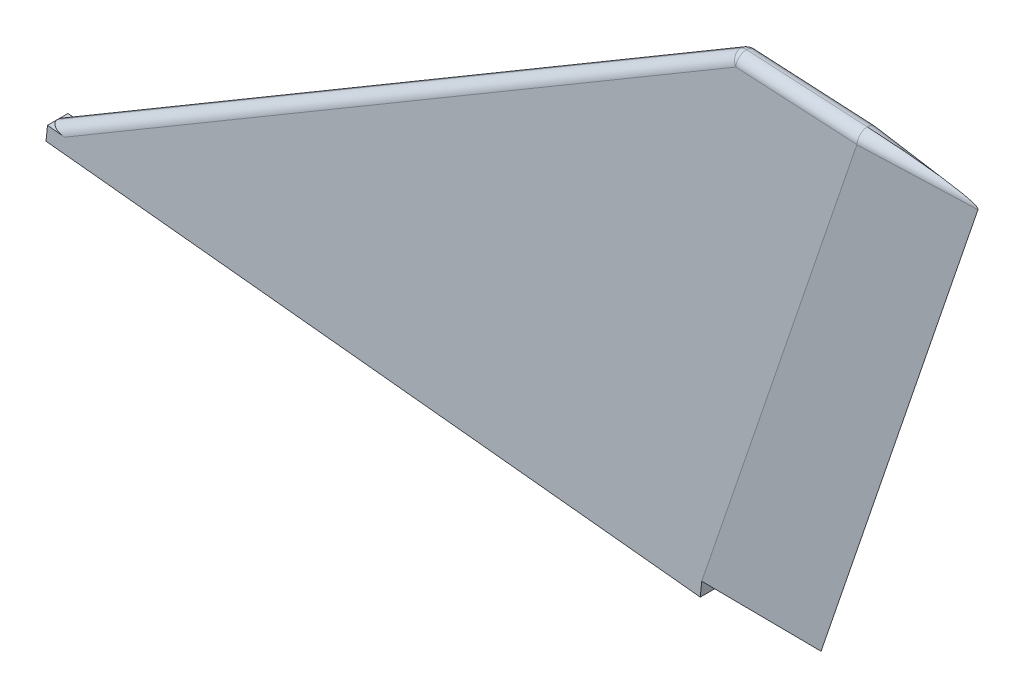
ISO-10303-21;
HEADER;
FILE_DESCRIPTION(('STEP AP214'),'2;1');
FILE_NAME('part.step','',(''),(''),'','','');
FILE_SCHEMA(('AUTOMOTIVE_DESIGN { 1 0 10303 214 1 1 1 1 }'));
ENDSEC;
DATA;
#1=APPLICATION_CONTEXT('core data for automotive mechanical design processes');
#2=APPLICATION_PROTOCOL_DEFINITION('international standard','automotive_design',2000,#1);
#3=PRODUCT_CONTEXT('',#1,'mechanical');
#4=PRODUCT('Part','Part','',(#3));
#5=PRODUCT_RELATED_PRODUCT_CATEGORY('part','',(#4));
#6=PRODUCT_DEFINITION_FORMATION('','',#4);
#7=PRODUCT_DEFINITION_CONTEXT('part definition',#1,'design');
#8=PRODUCT_DEFINITION('design','',#6,#7);
#9=PRODUCT_DEFINITION_SHAPE('','',#8);
#10=(LENGTH_UNIT() NAMED_UNIT(*) SI_UNIT(.MILLI.,.METRE.));
#11=(NAMED_UNIT(*) PLANE_ANGLE_UNIT() SI_UNIT($,.RADIAN.));
#12=(NAMED_UNIT(*) SI_UNIT($,.STERADIAN.) SOLID_ANGLE_UNIT());
#13=UNCERTAINTY_MEASURE_WITH_UNIT(LENGTH_MEASURE(1.E-05),#10,'distance_accuracy_value','');
#14=(GEOMETRIC_REPRESENTATION_CONTEXT(3) GLOBAL_UNCERTAINTY_ASSIGNED_CONTEXT((#13)) GLOBAL_UNIT_ASSIGNED_CONTEXT((#10,
#11,#12)) REPRESENTATION_CONTEXT('',''));
#15=CARTESIAN_POINT('',(0.,0.,0.));
#16=DIRECTION('',(0.,0.,1.));
#17=DIRECTION('',(1.,0.,0.));
#18=AXIS2_PLACEMENT_3D('',#15,#16,#17);
#19=CARTESIAN_POINT('',(0.,0.,3.5));
#20=DIRECTION('',(0.102966143613121,0.994684861284941,0.));
#21=DIRECTION('',(-0.994684861284941,0.102966143613121,0.));
#22=AXIS2_PLACEMENT_3D('',#19,#20,#21);
#23=PLANE('',#22);
#24=DIRECTION('',(0.,0.,1.));
#25=VECTOR('',#24,1.);
#26=CARTESIAN_POINT('',(223.462347280627,-23.1320059626714,3.5));
#27=LINE('',#26,#25);
#28=CARTESIAN_POINT('',(223.462347280627,-23.1320059626714,-3.5));
#29=VERTEX_POINT('',#28);
#30=CARTESIAN_POINT('',(223.462347280627,-23.1320059626714,3.5));
#31=VERTEX_POINT('',#30);
#32=EDGE_CURVE('E210',#29,#31,#27,.T.);
#33=ORIENTED_EDGE('',*,*,#32,.F.);
#34=DIRECTION('',(0.990367658718156,-0.102519242572601,0.0930682838965964));
#35=VECTOR('',#34,1.);
#36=CARTESIAN_POINT('',(2.5807677641766,-0.267151652328405,-24.2570081363247));
#37=LINE('',#36,#35);
#38=CARTESIAN_POINT('',(260.706902142783,-26.9874262409992,0.));
#39=VERTEX_POINT('',#38);
#40=EDGE_CURVE('E183',#29,#39,#37,.T.);
#41=ORIENTED_EDGE('',*,*,#40,.T.);
#42=DIRECTION('',(-0.990367658718156,0.102519242572601,0.0930682838965968));
#43=VECTOR('',#42,1.);
#44=CARTESIAN_POINT('',(1.9355650352115,-0.200362622520131,24.317640074597));
#45=LINE('',#44,#43);
#46=EDGE_CURVE('E191',#39,#31,#45,.T.);
#47=ORIENTED_EDGE('',*,*,#46,.T.);
#48=EDGE_LOOP('',(#33,#41,#47));
#49=FACE_BOUND('',#48,.T.);
#50=ADVANCED_FACE('F32',(#49),#23,.F.);
#51=CARTESIAN_POINT('',(0.,0.,3.5));
#52=DIRECTION('',(0.,0.,-1.));
#53=DIRECTION('',(-1.,0.,0.));
#54=AXIS2_PLACEMENT_3D('',#51,#52,#53);
#55=PLANE('',#54);
#56=DIRECTION('',(0.322265695230508,0.946649260115697,0.));
#57=VECTOR('',#56,1.);
#58=CARTESIAN_POINT('',(207.311566140184,-70.5746138578575,3.5));
#59=LINE('',#58,#57);
#60=CARTESIAN_POINT('',(276.424242310279,132.44253853945,3.5));
#61=VERTEX_POINT('',#60);
#62=EDGE_CURVE('E194',#31,#61,#59,.T.);
#63=ORIENTED_EDGE('',*,*,#62,.T.);
#64=CARTESIAN_POINT('',(238.415187689493,134.571777891605,3.5));
#65=DIRECTION('',(0.,0.,-1.));
#66=DIRECTION('',(0.998564849047937,-0.0535559730176782,0.));
#67=AXIS2_PLACEMENT_3D('',#64,#65,#66);
#68=ELLIPSE('',#67,38.0812921018752,3.5);
#69=CARTESIAN_POINT('',(276.441827388753,132.532297239319,3.5));
#70=VERTEX_POINT('',#69);
#71=EDGE_CURVE('E124',#61,#70,#68,.F.);
#72=ORIENTED_EDGE('',*,*,#71,.T.);
#73=DIRECTION('',(-0.998564849047937,0.0535559730176782,0.));
#74=VECTOR('',#73,1.);
#75=CARTESIAN_POINT('',(7.88061171036618,146.936025984807,3.5));
#76=LINE('',#75,#74);
#77=CARTESIAN_POINT('',(235.077713941852,134.750776435512,3.5));
#78=VERTEX_POINT('',#77);
#79=EDGE_CURVE('E168',#70,#78,#76,.T.);
#80=ORIENTED_EDGE('',*,*,#79,.T.);
#81=DIRECTION('',(-0.861077465248671,-0.5084737936619,0.));
#82=VECTOR('',#81,1.);
#83=CARTESIAN_POINT('',(1.77965827781667,-3.01377112837037,3.5));
#84=LINE('',#83,#82);
#85=CARTESIAN_POINT('',(5.85666837283251,-0.606260917646307,3.5));
#86=VERTEX_POINT('',#85);
#87=EDGE_CURVE('E197',#78,#86,#84,.T.);
#88=ORIENTED_EDGE('',*,*,#87,.T.);
#89=DIRECTION('',(-0.994684861284941,0.102966143613121,0.));
#90=VECTOR('',#89,1.);
#91=CARTESIAN_POINT('',(0.,0.,3.5));
#92=LINE('',#91,#90);
#93=CARTESIAN_POINT('',(0.,0.,3.5));
#94=VERTEX_POINT('',#93);
#95=EDGE_CURVE('E242',#86,#94,#92,.T.);
#96=ORIENTED_EDGE('',*,*,#95,.T.);
#97=DIRECTION('',(0.102966143613121,0.994684861284941,0.));
#98=VECTOR('',#97,1.);
#99=CARTESIAN_POINT('',(-0.514830718065607,-4.9734243064247,3.5));
#100=LINE('',#99,#98);
#101=CARTESIAN_POINT('',(-0.514830718065607,-4.9734243064247,3.5));
#102=VERTEX_POINT('',#101);
#103=EDGE_CURVE('E148',#102,#94,#100,.T.);
#104=ORIENTED_EDGE('',*,*,#103,.F.);
#105=DIRECTION('',(-0.994684861284941,0.102966143613121,0.));
#106=VECTOR('',#105,1.);
#107=CARTESIAN_POINT('',(-0.514830718065607,-4.9734243064247,3.5));
#108=LINE('',#107,#106);
#109=CARTESIAN_POINT('',(222.947516562561,-28.1054302690961,3.5));
#110=VERTEX_POINT('',#109);
#111=EDGE_CURVE('E215',#110,#102,#108,.T.);
#112=ORIENTED_EDGE('',*,*,#111,.F.);
#113=DIRECTION('',(0.102966143613121,0.994684861284941,0.));
#114=VECTOR('',#113,1.);
#115=CARTESIAN_POINT('',(222.947516562561,-28.1054302690961,3.5));
#116=LINE('',#115,#114);
#117=EDGE_CURVE('E204',#110,#31,#116,.T.);
#118=ORIENTED_EDGE('',*,*,#117,.T.);
#119=EDGE_LOOP('',(#63,#72,#80,#88,#96,#104,#112,#118));
#120=FACE_BOUND('',#119,.T.);
#121=ADVANCED_FACE('F200',(#120),#55,.F.);
#122=CARTESIAN_POINT('',(0.,0.,-3.5));
#123=DIRECTION('',(0.,0.,-1.));
#124=DIRECTION('',(-1.,0.,0.));
#125=AXIS2_PLACEMENT_3D('',#122,#123,#124);
#126=PLANE('',#125);
#127=DIRECTION('',(-0.998564849047937,0.0535559730176782,0.));
#128=VECTOR('',#127,1.);
#129=CARTESIAN_POINT('',(277.438934642848,132.47881944141,-3.5));
#130=LINE('',#129,#128);
#131=CARTESIAN_POINT('',(235.077713941852,134.750776435511,-3.5));
#132=VERTEX_POINT('',#131);
#133=CARTESIAN_POINT('',(276.441827388753,132.532297239319,-3.5));
#134=VERTEX_POINT('',#133);
#135=EDGE_CURVE('E117',#132,#134,#130,.F.);
#136=ORIENTED_EDGE('',*,*,#135,.T.);
#137=CARTESIAN_POINT('',(238.415187689493,134.571777891605,-3.5));
#138=DIRECTION('',(0.,0.,-1.));
#139=DIRECTION('',(-0.998564849047937,0.0535559730176782,0.));
#140=AXIS2_PLACEMENT_3D('',#137,#138,#139);
#141=ELLIPSE('',#140,38.0812921018753,3.5);
#142=CARTESIAN_POINT('',(276.424242310279,132.44253853945,-3.5));
#143=VERTEX_POINT('',#142);
#144=EDGE_CURVE('E136',#134,#143,#141,.T.);
#145=ORIENTED_EDGE('',*,*,#144,.T.);
#146=DIRECTION('',(0.322265695230508,0.946649260115697,0.));
#147=VECTOR('',#146,1.);
#148=CARTESIAN_POINT('',(199.07844233664,-94.759256134135,-3.5));
#149=LINE('',#148,#147);
#150=EDGE_CURVE('E126',#29,#143,#149,.T.);
#151=ORIENTED_EDGE('',*,*,#150,.F.);
#152=DIRECTION('',(0.102966143613121,0.994684861284941,0.));
#153=VECTOR('',#152,1.);
#154=CARTESIAN_POINT('',(222.947516562561,-28.1054302690961,-3.5));
#155=LINE('',#154,#153);
#156=CARTESIAN_POINT('',(222.947516562561,-28.1054302690961,-3.5));
#157=VERTEX_POINT('',#156);
#158=EDGE_CURVE('E214',#157,#29,#155,.T.);
#159=ORIENTED_EDGE('',*,*,#158,.F.);
#160=DIRECTION('',(0.994684861284941,-0.102966143613121,0.));
#161=VECTOR('',#160,1.);
#162=CARTESIAN_POINT('',(-0.514830718065607,-4.9734243064247,-3.5));
#163=LINE('',#162,#161);
#164=CARTESIAN_POINT('',(-0.514830718065607,-4.9734243064247,-3.5));
#165=VERTEX_POINT('',#164);
#166=EDGE_CURVE('E249',#165,#157,#163,.T.);
#167=ORIENTED_EDGE('',*,*,#166,.F.);
#168=DIRECTION('',(0.102966143613121,0.994684861284941,0.));
#169=VECTOR('',#168,1.);
#170=CARTESIAN_POINT('',(-0.514830718065607,-4.9734243064247,-3.5));
#171=LINE('',#170,#169);
#172=CARTESIAN_POINT('',(0.,0.,-3.5));
#173=VERTEX_POINT('',#172);
#174=EDGE_CURVE('E226',#165,#173,#171,.T.);
#175=ORIENTED_EDGE('',*,*,#174,.T.);
#176=DIRECTION('',(0.994684861284941,-0.102966143613121,0.));
#177=VECTOR('',#176,1.);
#178=CARTESIAN_POINT('',(223.462347280627,-23.1320059626714,-3.5));
#179=LINE('',#178,#177);
#180=CARTESIAN_POINT('',(5.85666837283247,-0.606260917646303,-3.5));
#181=VERTEX_POINT('',#180);
#182=EDGE_CURVE('E121',#173,#181,#179,.T.);
#183=ORIENTED_EDGE('',*,*,#182,.T.);
#184=DIRECTION('',(-0.861077465248671,-0.5084737936619,0.));
#185=VECTOR('',#184,1.);
#186=CARTESIAN_POINT('',(235.988549897284,135.288633053938,-3.5));
#187=LINE('',#186,#185);
#188=EDGE_CURVE('E113',#181,#132,#187,.F.);
#189=ORIENTED_EDGE('',*,*,#188,.T.);
#190=EDGE_LOOP('',(#136,#145,#151,#159,#167,#175,#183,#189));
#191=FACE_BOUND('',#190,.T.);
#192=ADVANCED_FACE('F115',(#191),#126,.T.);
#193=CARTESIAN_POINT('',(233.631140330863,-106.521954010048,0.));
#194=DIRECTION('',(-0.0903601079041338,0.0307610899006781,-0.995433978849263));
#195=DIRECTION('',(-0.995905275386413,0.,0.0904028896524531));
#196=AXIS2_PLACEMENT_3D('',#193,#194,#195);
#197=PLANE('',#196);
#198=DIRECTION('',(0.322265695230508,0.946649260115697,0.));
#199=VECTOR('',#198,1.);
#200=CARTESIAN_POINT('',(233.631140330863,-106.521954010048,0.));
#201=LINE('',#200,#199);
#202=CARTESIAN_POINT('',(314.289932093839,130.411690105041,0.));
#203=VERTEX_POINT('',#202);
#204=EDGE_CURVE('E185',#39,#203,#201,.T.);
#205=ORIENTED_EDGE('',*,*,#204,.T.);
#206=DIRECTION('',(0.994338366520276,-0.0533292943153116,-0.0919086461309347));
#207=VECTOR('',#206,1.);
#208=CARTESIAN_POINT('',(247.105842365662,134.01497065325,6.20995723021824));
#209=LINE('',#208,#207);
#210=EDGE_CURVE('E142',#203,#61,#209,.F.);
#211=ORIENTED_EDGE('',*,*,#210,.T.);
#212=ORIENTED_EDGE('',*,*,#62,.F.);
#213=ORIENTED_EDGE('',*,*,#46,.F.);
#214=EDGE_LOOP('',(#205,#211,#212,#213));
#215=FACE_BOUND('',#214,.T.);
#216=ADVANCED_FACE('F207',(#215),#197,.F.);
#217=CARTESIAN_POINT('',(233.631140330863,-106.521954010049,0.));
#218=DIRECTION('',(-0.0903601079041334,0.030761089900678,0.995433978849263));
#219=DIRECTION('',(0.995905275386413,0.,0.0904028896524527));
#220=AXIS2_PLACEMENT_3D('',#217,#218,#219);
#221=PLANE('',#220);
#222=ORIENTED_EDGE('',*,*,#150,.T.);
#223=DIRECTION('',(-0.994338366520276,0.0533292943153116,-0.0919086461309343));
#224=VECTOR('',#223,1.);
#225=CARTESIAN_POINT('',(247.105842365662,134.01497065325,-6.20995723021822));
#226=LINE('',#225,#224);
#227=EDGE_CURVE('E51',#143,#203,#226,.F.);
#228=ORIENTED_EDGE('',*,*,#227,.T.);
#229=ORIENTED_EDGE('',*,*,#204,.F.);
#230=ORIENTED_EDGE('',*,*,#40,.F.);
#231=EDGE_LOOP('',(#222,#228,#229,#230));
#232=FACE_BOUND('',#231,.T.);
#233=ADVANCED_FACE('F181',(#232),#221,.F.);
#234=CARTESIAN_POINT('',(235.988549897284,135.288633053938,0.));
#235=DIRECTION('',(0.861077465248671,0.5084737936619,0.));
#236=DIRECTION('',(-0.5084737936619,0.861077465248671,0.));
#237=AXIS2_PLACEMENT_3D('',#234,#235,#236);
#238=CYLINDRICAL_SURFACE('',#237,3.5);
#239=CARTESIAN_POINT('',(235.077713941852,134.750776435511,0.));
#240=DIRECTION('',(0.861077465248667,0.508473793661906,0.));
#241=DIRECTION('',(-0.508473793661906,0.861077465248667,0.));
#242=AXIS2_PLACEMENT_3D('',#239,#240,#241);
#243=CIRCLE('',#242,3.5);
#244=CARTESIAN_POINT('',(233.298055664036,137.764547563882,0.));
#245=VERTEX_POINT('',#244);
#246=EDGE_CURVE('E36',#132,#245,#243,.T.);
#247=ORIENTED_EDGE('',*,*,#246,.F.);
#248=ORIENTED_EDGE('',*,*,#188,.F.);
#249=CARTESIAN_POINT('',(5.85666837283247,-0.606260917646317,0.));
#250=DIRECTION('',(0.102966143613121,0.994684861284941,0.));
#251=DIRECTION('',(0.994684861284941,-0.102966143613121,0.));
#252=AXIS2_PLACEMENT_3D('',#249,#250,#251);
#253=ELLIPSE('',#252,5.88796371673615,3.5);
#254=CARTESIAN_POINT('',(0.,0.,0.));
#255=VERTEX_POINT('',#254);
#256=EDGE_CURVE('E42',#255,#181,#253,.F.);
#257=ORIENTED_EDGE('',*,*,#256,.F.);
#258=DIRECTION('',(-0.861077465248671,-0.5084737936619,0.));
#259=VECTOR('',#258,1.);
#260=CARTESIAN_POINT('',(0.,0.,0.));
#261=LINE('',#260,#259);
#262=EDGE_CURVE('E76',#245,#255,#261,.T.);
#263=ORIENTED_EDGE('',*,*,#262,.F.);
#264=EDGE_LOOP('',(#247,#248,#257,#263));
#265=FACE_BOUND('',#264,.T.);
#266=ADVANCED_FACE('F34',(#265),#238,.T.);
#267=CARTESIAN_POINT('',(235.077713941852,134.750776435511,0.));
#268=DIRECTION('',(0.,0.,1.));
#269=DIRECTION('',(1.,0.,0.));
#270=AXIS2_PLACEMENT_3D('',#267,#268,#269);
#271=SPHERICAL_SURFACE('',#270,3.5);
#272=CARTESIAN_POINT('',(235.077713941852,134.750776435511,0.));
#273=DIRECTION('',(-0.998564849047937,0.053555973017681,0.));
#274=DIRECTION('',(-0.053555973017681,-0.998564849047937,0.));
#275=AXIS2_PLACEMENT_3D('',#272,#273,#274);
#276=CIRCLE('',#275,3.5);
#277=CARTESIAN_POINT('',(235.265159847414,138.245753407179,0.));
#278=VERTEX_POINT('',#277);
#279=EDGE_CURVE('E127',#132,#278,#276,.F.);
#280=ORIENTED_EDGE('',*,*,#279,.F.);
#281=ORIENTED_EDGE('',*,*,#246,.T.);
#282=CARTESIAN_POINT('',(235.077713941852,134.750776435511,0.));
#283=DIRECTION('',(0.,0.,-1.));
#284=DIRECTION('',(-1.,0.,0.));
#285=AXIS2_PLACEMENT_3D('',#282,#283,#284);
#286=CIRCLE('',#285,3.5);
#287=EDGE_CURVE('E67',#278,#245,#286,.F.);
#288=ORIENTED_EDGE('',*,*,#287,.F.);
#289=EDGE_LOOP('',(#280,#281,#288));
#290=FACE_BOUND('',#289,.T.);
#291=ADVANCED_FACE('F128',(#290),#271,.T.);
#292=CARTESIAN_POINT('',(315.29484208677,130.448495662679,3.60613729549153));
#293=DIRECTION('',(-0.994338366520275,0.0533292943153116,-0.0919086461309342));
#294=DIRECTION('',(-0.0920396202877102,0.,0.995755345603173));
#295=AXIS2_PLACEMENT_3D('',#292,#293,#294);
#296=CYLINDRICAL_SURFACE('',#295,3.5);
#297=ORIENTED_EDGE('',*,*,#227,.F.);
#298=ORIENTED_EDGE('',*,*,#144,.F.);
#299=CARTESIAN_POINT('',(276.280877473053,132.540929457197,0.));
#300=DIRECTION('',(-0.997507668797845,0.053499273328116,-0.0460030264531912));
#301=DIRECTION('',(0.0459370051659809,-0.00246373684345879,-0.998941300356105));
#302=AXIS2_PLACEMENT_3D('',#299,#300,#301);
#303=ELLIPSE('',#302,3.50370937586854,3.5);
#304=CARTESIAN_POINT('',(276.468323378615,136.035906428864,0.));
#305=VERTEX_POINT('',#304);
#306=EDGE_CURVE('E132',#305,#134,#303,.T.);
#307=ORIENTED_EDGE('',*,*,#306,.F.);
#308=CARTESIAN_POINT('',(276.280877473053,132.540929457197,0.));
#309=DIRECTION('',(0.,0.,-1.));
#310=DIRECTION('',(0.998564849047937,-0.0535559730176782,0.));
#311=AXIS2_PLACEMENT_3D('',#308,#309,#310);
#312=ELLIPSE('',#311,38.0812921018752,3.5);
#313=EDGE_CURVE('E156',#203,#305,#312,.F.);
#314=ORIENTED_EDGE('',*,*,#313,.F.);
#315=EDGE_LOOP('',(#297,#298,#307,#314));
#316=FACE_BOUND('',#315,.T.);
#317=ADVANCED_FACE('F176',(#316),#296,.T.);
#318=CARTESIAN_POINT('',(1.77965827781667,-3.01377112837037,0.));
#319=DIRECTION('',(-0.861077465248671,-0.5084737936619,0.));
#320=DIRECTION('',(0.5084737936619,-0.861077465248671,0.));
#321=AXIS2_PLACEMENT_3D('',#318,#319,#320);
#322=CYLINDRICAL_SURFACE('',#321,3.5);
#323=CARTESIAN_POINT('',(5.85666837283252,-0.606260917646307,0.));
#324=DIRECTION('',(0.102966143613121,0.994684861284941,0.));
#325=DIRECTION('',(-0.994684861284941,0.102966143613121,0.));
#326=AXIS2_PLACEMENT_3D('',#323,#324,#325);
#327=ELLIPSE('',#326,5.88796371673615,3.5);
#328=EDGE_CURVE('E11',#86,#255,#327,.F.);
#329=ORIENTED_EDGE('',*,*,#328,.F.);
#330=ORIENTED_EDGE('',*,*,#87,.F.);
#331=CARTESIAN_POINT('',(235.077713941852,134.750776435511,0.));
#332=DIRECTION('',(0.86107746524867,0.5084737936619,0.));
#333=DIRECTION('',(-0.5084737936619,0.86107746524867,0.));
#334=AXIS2_PLACEMENT_3D('',#331,#332,#333);
#335=CIRCLE('',#334,3.5);
#336=EDGE_CURVE('E153',#245,#78,#335,.T.);
#337=ORIENTED_EDGE('',*,*,#336,.F.);
#338=ORIENTED_EDGE('',*,*,#262,.T.);
#339=EDGE_LOOP('',(#329,#330,#337,#338));
#340=FACE_BOUND('',#339,.T.);
#341=ADVANCED_FACE('F261',(#340),#322,.T.);
#342=CARTESIAN_POINT('',(315.304624426407,130.447971007002,0.));
#343=DIRECTION('',(0.998564849047937,-0.0535559730176782,0.));
#344=DIRECTION('',(0.0535559730176782,0.998564849047937,0.));
#345=AXIS2_PLACEMENT_3D('',#342,#343,#344);
#346=CYLINDRICAL_SURFACE('',#345,3.5);
#347=ORIENTED_EDGE('',*,*,#135,.F.);
#348=ORIENTED_EDGE('',*,*,#279,.T.);
#349=DIRECTION('',(-0.998564849047937,0.0535559730176782,0.));
#350=VECTOR('',#349,1.);
#351=CARTESIAN_POINT('',(234.208891619467,138.302404182308,0.));
#352=LINE('',#351,#350);
#353=EDGE_CURVE('E151',#305,#278,#352,.T.);
#354=ORIENTED_EDGE('',*,*,#353,.F.);
#355=ORIENTED_EDGE('',*,*,#306,.T.);
#356=EDGE_LOOP('',(#347,#348,#354,#355));
#357=FACE_BOUND('',#356,.T.);
#358=ADVANCED_FACE('F135',(#357),#346,.T.);
#359=CARTESIAN_POINT('',(314.65512403533,130.482805625357,-3.54700690085619));
#360=DIRECTION('',(0.994338366520275,-0.0533292943153116,-0.0919086461309346));
#361=DIRECTION('',(-0.0920396202877106,0.,-0.995755345603173));
#362=AXIS2_PLACEMENT_3D('',#359,#360,#361);
#363=CYLINDRICAL_SURFACE('',#362,3.5);
#364=ORIENTED_EDGE('',*,*,#210,.F.);
#365=ORIENTED_EDGE('',*,*,#313,.T.);
#366=CARTESIAN_POINT('',(276.280877473067,132.540929457196,-6.2233204700668E-13));
#367=DIRECTION('',(0.997507668797845,-0.053499273328116,-0.0460030264531914));
#368=DIRECTION('',(-0.0459370051659807,0.00246373684345878,-0.998941300356105));
#369=AXIS2_PLACEMENT_3D('',#366,#367,#368);
#370=ELLIPSE('',#369,3.50370937586854,3.5);
#371=EDGE_CURVE('E147',#70,#305,#370,.F.);
#372=ORIENTED_EDGE('',*,*,#371,.F.);
#373=ORIENTED_EDGE('',*,*,#71,.F.);
#374=EDGE_LOOP('',(#364,#365,#372,#373));
#375=FACE_BOUND('',#374,.T.);
#376=ADVANCED_FACE('F173',(#375),#363,.T.);
#377=CARTESIAN_POINT('',(235.077713941852,134.750776435511,0.));
#378=DIRECTION('',(0.,0.,1.));
#379=DIRECTION('',(1.,0.,0.));
#380=AXIS2_PLACEMENT_3D('',#377,#378,#379);
#381=SPHERICAL_SURFACE('',#380,3.5);
#382=ORIENTED_EDGE('',*,*,#287,.T.);
#383=ORIENTED_EDGE('',*,*,#336,.T.);
#384=CARTESIAN_POINT('',(235.077713941852,134.750776435512,0.));
#385=DIRECTION('',(-0.998564849047938,0.0535559730176656,0.));
#386=DIRECTION('',(-0.0535559730176656,-0.998564849047938,0.));
#387=AXIS2_PLACEMENT_3D('',#384,#385,#386);
#388=CIRCLE('',#387,3.5);
#389=EDGE_CURVE('E145',#278,#78,#388,.F.);
#390=ORIENTED_EDGE('',*,*,#389,.F.);
#391=EDGE_LOOP('',(#382,#383,#390));
#392=FACE_BOUND('',#391,.T.);
#393=ADVANCED_FACE('F162',(#392),#381,.T.);
#394=CARTESIAN_POINT('',(7.88061171036618,146.936025984807,0.));
#395=DIRECTION('',(-0.998564849047937,0.0535559730176782,0.));
#396=DIRECTION('',(-0.0535559730176782,-0.998564849047937,0.));
#397=AXIS2_PLACEMENT_3D('',#394,#395,#396);
#398=CYLINDRICAL_SURFACE('',#397,3.5);
#399=ORIENTED_EDGE('',*,*,#371,.T.);
#400=ORIENTED_EDGE('',*,*,#353,.T.);
#401=ORIENTED_EDGE('',*,*,#389,.T.);
#402=ORIENTED_EDGE('',*,*,#79,.F.);
#403=EDGE_LOOP('',(#399,#400,#401,#402));
#404=FACE_BOUND('',#403,.T.);
#405=ADVANCED_FACE('F166',(#404),#398,.T.);
#406=CARTESIAN_POINT('',(0.,0.,0.));
#407=DIRECTION('',(0.102966143613121,0.994684861284941,0.));
#408=DIRECTION('',(-0.994684861284941,0.102966143613121,0.));
#409=AXIS2_PLACEMENT_3D('',#406,#407,#408);
#410=PLANE('',#409);
#411=DIRECTION('',(0.,0.,-1.));
#412=VECTOR('',#411,1.);
#413=CARTESIAN_POINT('',(0.,0.,0.));
#414=LINE('',#413,#412);
#415=EDGE_CURVE('E255',#255,#173,#414,.T.);
#416=ORIENTED_EDGE('',*,*,#415,.F.);
#417=ORIENTED_EDGE('',*,*,#256,.T.);
#418=ORIENTED_EDGE('',*,*,#182,.F.);
#419=EDGE_LOOP('',(#416,#417,#418));
#420=FACE_BOUND('',#419,.T.);
#421=ADVANCED_FACE('F258',(#420),#410,.T.);
#422=CARTESIAN_POINT('',(-0.514830718065607,-4.9734243064247,0.));
#423=DIRECTION('',(0.994684861284941,-0.102966143613121,0.));
#424=DIRECTION('',(0.102966143613121,0.994684861284941,0.));
#425=AXIS2_PLACEMENT_3D('',#422,#423,#424);
#426=PLANE('',#425);
#427=EDGE_CURVE('E220',#94,#255,#414,.T.);
#428=ORIENTED_EDGE('',*,*,#427,.T.);
#429=ORIENTED_EDGE('',*,*,#415,.T.);
#430=ORIENTED_EDGE('',*,*,#174,.F.);
#431=DIRECTION('',(0.,0.,-1.));
#432=VECTOR('',#431,1.);
#433=CARTESIAN_POINT('',(-0.514830718065607,-4.9734243064247,0.));
#434=LINE('',#433,#432);
#435=EDGE_CURVE('E218',#102,#165,#434,.T.);
#436=ORIENTED_EDGE('',*,*,#435,.F.);
#437=ORIENTED_EDGE('',*,*,#103,.T.);
#438=EDGE_LOOP('',(#428,#429,#430,#436,#437));
#439=FACE_BOUND('',#438,.T.);
#440=ADVANCED_FACE('F235',(#439),#426,.F.);
#441=CARTESIAN_POINT('',(222.947516562561,-28.1054302690961,3.5));
#442=DIRECTION('',(-0.994684861284941,0.102966143613121,0.));
#443=DIRECTION('',(-0.102966143613121,-0.994684861284941,0.));
#444=AXIS2_PLACEMENT_3D('',#441,#442,#443);
#445=PLANE('',#444);
#446=ORIENTED_EDGE('',*,*,#32,.T.);
#447=ORIENTED_EDGE('',*,*,#117,.F.);
#448=DIRECTION('',(0.,0.,1.));
#449=VECTOR('',#448,1.);
#450=CARTESIAN_POINT('',(222.947516562561,-28.1054302690961,3.5));
#451=LINE('',#450,#449);
#452=EDGE_CURVE('E225',#157,#110,#451,.T.);
#453=ORIENTED_EDGE('',*,*,#452,.F.);
#454=ORIENTED_EDGE('',*,*,#158,.T.);
#455=EDGE_LOOP('',(#446,#447,#453,#454));
#456=FACE_BOUND('',#455,.T.);
#457=ADVANCED_FACE('F212',(#456),#445,.F.);
#458=CARTESIAN_POINT('',(-0.514830718065607,-4.97342430642471,0.));
#459=DIRECTION('',(0.102966143613121,0.994684861284941,0.));
#460=DIRECTION('',(-0.994684861284941,0.102966143613121,0.));
#461=AXIS2_PLACEMENT_3D('',#458,#459,#460);
#462=PLANE('',#461);
#463=ORIENTED_EDGE('',*,*,#111,.T.);
#464=ORIENTED_EDGE('',*,*,#435,.T.);
#465=ORIENTED_EDGE('',*,*,#166,.T.);
#466=ORIENTED_EDGE('',*,*,#452,.T.);
#467=EDGE_LOOP('',(#463,#464,#465,#466));
#468=FACE_BOUND('',#467,.T.);
#469=ADVANCED_FACE('F250',(#468),#462,.F.);
#470=ORIENTED_EDGE('',*,*,#95,.F.);
#471=ORIENTED_EDGE('',*,*,#328,.T.);
#472=ORIENTED_EDGE('',*,*,#427,.F.);
#473=EDGE_LOOP('',(#470,#471,#472));
#474=FACE_BOUND('',#473,.T.);
#475=ADVANCED_FACE('F260',(#474),#410,.T.);
#476=CLOSED_SHELL('',(#50,#121,#192,#216,#233,#266,#291,#317,#341,#358,#376,#393,#405,#421,#440,
#457,#469,#475));
#477=MANIFOLD_SOLID_BREP('B2',#476);
#478=ADVANCED_BREP_SHAPE_REPRESENTATION('',(#18,#477),#14);
#479=SHAPE_DEFINITION_REPRESENTATION(#9,#478);
ENDSEC;
END-ISO-10303-21;
